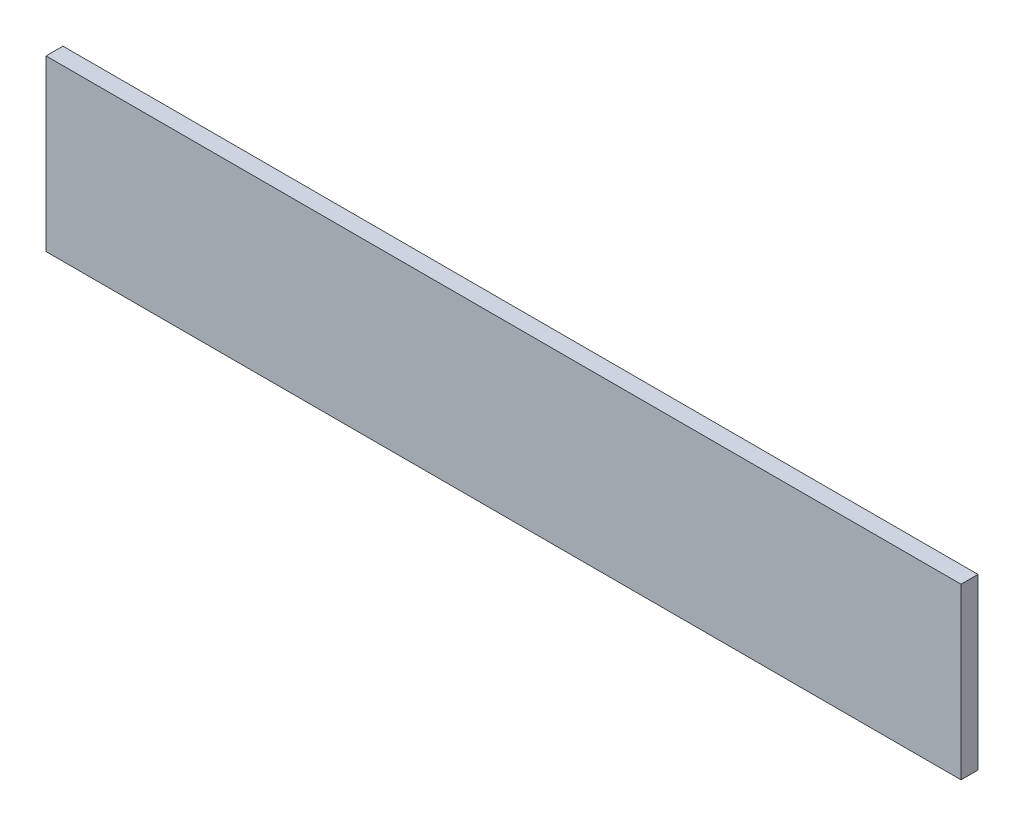
ISO-10303-21;
HEADER;
FILE_DESCRIPTION(('STEP AP214'),'2;1');
FILE_NAME('part.step','',(''),(''),'','','');
FILE_SCHEMA(('AUTOMOTIVE_DESIGN { 1 0 10303 214 1 1 1 1 }'));
ENDSEC;
DATA;
#1=APPLICATION_CONTEXT('core data for automotive mechanical design processes');
#2=APPLICATION_PROTOCOL_DEFINITION('international standard','automotive_design',2000,#1);
#3=PRODUCT_CONTEXT('',#1,'mechanical');
#4=PRODUCT('Part','Part','',(#3));
#5=PRODUCT_RELATED_PRODUCT_CATEGORY('part','',(#4));
#6=PRODUCT_DEFINITION_FORMATION('','',#4);
#7=PRODUCT_DEFINITION_CONTEXT('part definition',#1,'design');
#8=PRODUCT_DEFINITION('design','',#6,#7);
#9=PRODUCT_DEFINITION_SHAPE('','',#8);
#10=(LENGTH_UNIT() NAMED_UNIT(*) SI_UNIT(.MILLI.,.METRE.));
#11=(NAMED_UNIT(*) PLANE_ANGLE_UNIT() SI_UNIT($,.RADIAN.));
#12=(NAMED_UNIT(*) SI_UNIT($,.STERADIAN.) SOLID_ANGLE_UNIT());
#13=UNCERTAINTY_MEASURE_WITH_UNIT(LENGTH_MEASURE(1.E-05),#10,'distance_accuracy_value','');
#14=(GEOMETRIC_REPRESENTATION_CONTEXT(3) GLOBAL_UNCERTAINTY_ASSIGNED_CONTEXT((#13)) GLOBAL_UNIT_ASSIGNED_CONTEXT((#10,
#11,#12)) REPRESENTATION_CONTEXT('',''));
#15=CARTESIAN_POINT('',(0.,0.,0.));
#16=DIRECTION('',(0.,0.,1.));
#17=DIRECTION('',(1.,0.,0.));
#18=AXIS2_PLACEMENT_3D('',#15,#16,#17);
#19=CARTESIAN_POINT('',(135.,25.,5.));
#20=DIRECTION('',(-1.,0.,0.));
#21=DIRECTION('',(0.,-1.,0.));
#22=AXIS2_PLACEMENT_3D('',#19,#20,#21);
#23=PLANE('',#22);
#24=DIRECTION('',(0.,1.,0.));
#25=VECTOR('',#24,1.);
#26=CARTESIAN_POINT('',(135.,25.,0.));
#27=LINE('',#26,#25);
#28=CARTESIAN_POINT('',(135.,-25.,0.));
#29=VERTEX_POINT('',#28);
#30=CARTESIAN_POINT('',(135.,25.,0.));
#31=VERTEX_POINT('',#30);
#32=EDGE_CURVE('E96',#29,#31,#27,.T.);
#33=ORIENTED_EDGE('',*,*,#32,.T.);
#34=DIRECTION('',(0.,0.,-1.));
#35=VECTOR('',#34,1.);
#36=CARTESIAN_POINT('',(135.,25.,5.));
#37=LINE('',#36,#35);
#38=CARTESIAN_POINT('',(135.,25.,5.));
#39=VERTEX_POINT('',#38);
#40=EDGE_CURVE('E11',#39,#31,#37,.T.);
#41=ORIENTED_EDGE('',*,*,#40,.F.);
#42=DIRECTION('',(0.,1.,0.));
#43=VECTOR('',#42,1.);
#44=CARTESIAN_POINT('',(135.,25.,5.));
#45=LINE('',#44,#43);
#46=CARTESIAN_POINT('',(135.,-25.,5.));
#47=VERTEX_POINT('',#46);
#48=EDGE_CURVE('E84',#47,#39,#45,.T.);
#49=ORIENTED_EDGE('',*,*,#48,.F.);
#50=DIRECTION('',(0.,0.,-1.));
#51=VECTOR('',#50,1.);
#52=CARTESIAN_POINT('',(135.,-25.,5.));
#53=LINE('',#52,#51);
#54=EDGE_CURVE('E92',#47,#29,#53,.T.);
#55=ORIENTED_EDGE('',*,*,#54,.T.);
#56=EDGE_LOOP('',(#33,#41,#49,#55));
#57=FACE_BOUND('',#56,.T.);
#58=ADVANCED_FACE('F33',(#57),#23,.F.);
#59=CARTESIAN_POINT('',(-135.,25.,5.));
#60=DIRECTION('',(0.,-1.,0.));
#61=DIRECTION('',(0.,0.,-1.));
#62=AXIS2_PLACEMENT_3D('',#59,#60,#61);
#63=PLANE('',#62);
#64=DIRECTION('',(-1.,0.,0.));
#65=VECTOR('',#64,1.);
#66=CARTESIAN_POINT('',(-135.,25.,0.));
#67=LINE('',#66,#65);
#68=CARTESIAN_POINT('',(-135.,25.,0.));
#69=VERTEX_POINT('',#68);
#70=EDGE_CURVE('E88',#31,#69,#67,.T.);
#71=ORIENTED_EDGE('',*,*,#70,.T.);
#72=DIRECTION('',(0.,0.,-1.));
#73=VECTOR('',#72,1.);
#74=CARTESIAN_POINT('',(-135.,25.,5.));
#75=LINE('',#74,#73);
#76=CARTESIAN_POINT('',(-135.,25.,5.));
#77=VERTEX_POINT('',#76);
#78=EDGE_CURVE('E41',#77,#69,#75,.T.);
#79=ORIENTED_EDGE('',*,*,#78,.F.);
#80=DIRECTION('',(-1.,0.,0.));
#81=VECTOR('',#80,1.);
#82=CARTESIAN_POINT('',(-135.,25.,5.));
#83=LINE('',#82,#81);
#84=EDGE_CURVE('E79',#39,#77,#83,.T.);
#85=ORIENTED_EDGE('',*,*,#84,.F.);
#86=ORIENTED_EDGE('',*,*,#40,.T.);
#87=EDGE_LOOP('',(#71,#79,#85,#86));
#88=FACE_BOUND('',#87,.T.);
#89=ADVANCED_FACE('F87',(#88),#63,.F.);
#90=CARTESIAN_POINT('',(-135.,25.,5.));
#91=DIRECTION('',(1.,0.,0.));
#92=DIRECTION('',(0.,0.,-1.));
#93=AXIS2_PLACEMENT_3D('',#90,#91,#92);
#94=PLANE('',#93);
#95=DIRECTION('',(0.,-1.,0.));
#96=VECTOR('',#95,1.);
#97=CARTESIAN_POINT('',(-135.,25.,0.));
#98=LINE('',#97,#96);
#99=CARTESIAN_POINT('',(-135.,-25.,0.));
#100=VERTEX_POINT('',#99);
#101=EDGE_CURVE('E66',#69,#100,#98,.T.);
#102=ORIENTED_EDGE('',*,*,#101,.T.);
#103=DIRECTION('',(0.,0.,-1.));
#104=VECTOR('',#103,1.);
#105=CARTESIAN_POINT('',(-135.,-25.,5.));
#106=LINE('',#105,#104);
#107=CARTESIAN_POINT('',(-135.,-25.,5.));
#108=VERTEX_POINT('',#107);
#109=EDGE_CURVE('E89',#108,#100,#106,.T.);
#110=ORIENTED_EDGE('',*,*,#109,.F.);
#111=DIRECTION('',(0.,-1.,0.));
#112=VECTOR('',#111,1.);
#113=CARTESIAN_POINT('',(-135.,25.,5.));
#114=LINE('',#113,#112);
#115=EDGE_CURVE('E82',#77,#108,#114,.T.);
#116=ORIENTED_EDGE('',*,*,#115,.F.);
#117=ORIENTED_EDGE('',*,*,#78,.T.);
#118=EDGE_LOOP('',(#102,#110,#116,#117));
#119=FACE_BOUND('',#118,.T.);
#120=ADVANCED_FACE('F90',(#119),#94,.F.);
#121=CARTESIAN_POINT('',(-135.,-25.,5.));
#122=DIRECTION('',(0.,1.,0.));
#123=DIRECTION('',(0.,0.,1.));
#124=AXIS2_PLACEMENT_3D('',#121,#122,#123);
#125=PLANE('',#124);
#126=DIRECTION('',(1.,0.,0.));
#127=VECTOR('',#126,1.);
#128=CARTESIAN_POINT('',(-135.,-25.,0.));
#129=LINE('',#128,#127);
#130=EDGE_CURVE('E72',#100,#29,#129,.T.);
#131=ORIENTED_EDGE('',*,*,#130,.T.);
#132=ORIENTED_EDGE('',*,*,#54,.F.);
#133=DIRECTION('',(1.,0.,0.));
#134=VECTOR('',#133,1.);
#135=CARTESIAN_POINT('',(-135.,-25.,5.));
#136=LINE('',#135,#134);
#137=EDGE_CURVE('E49',#108,#47,#136,.T.);
#138=ORIENTED_EDGE('',*,*,#137,.F.);
#139=ORIENTED_EDGE('',*,*,#109,.T.);
#140=EDGE_LOOP('',(#131,#132,#138,#139));
#141=FACE_BOUND('',#140,.T.);
#142=ADVANCED_FACE('F103',(#141),#125,.F.);
#143=CARTESIAN_POINT('',(0.,0.,5.));
#144=DIRECTION('',(0.,0.,1.));
#145=DIRECTION('',(1.,0.,0.));
#146=AXIS2_PLACEMENT_3D('',#143,#144,#145);
#147=PLANE('',#146);
#148=ORIENTED_EDGE('',*,*,#48,.T.);
#149=ORIENTED_EDGE('',*,*,#84,.T.);
#150=ORIENTED_EDGE('',*,*,#115,.T.);
#151=ORIENTED_EDGE('',*,*,#137,.T.);
#152=EDGE_LOOP('',(#148,#149,#150,#151));
#153=FACE_BOUND('',#152,.T.);
#154=ADVANCED_FACE('F80',(#153),#147,.T.);
#155=CARTESIAN_POINT('',(0.,0.,0.));
#156=DIRECTION('',(0.,0.,1.));
#157=DIRECTION('',(1.,0.,0.));
#158=AXIS2_PLACEMENT_3D('',#155,#156,#157);
#159=PLANE('',#158);
#160=ORIENTED_EDGE('',*,*,#32,.F.);
#161=ORIENTED_EDGE('',*,*,#130,.F.);
#162=ORIENTED_EDGE('',*,*,#101,.F.);
#163=ORIENTED_EDGE('',*,*,#70,.F.);
#164=EDGE_LOOP('',(#160,#161,#162,#163));
#165=FACE_BOUND('',#164,.T.);
#166=ADVANCED_FACE('F106',(#165),#159,.F.);
#167=CLOSED_SHELL('',(#58,#89,#120,#142,#154,#166));
#168=MANIFOLD_SOLID_BREP('B2',#167);
#169=ADVANCED_BREP_SHAPE_REPRESENTATION('',(#18,#168),#14);
#170=SHAPE_DEFINITION_REPRESENTATION(#9,#169);
ENDSEC;
END-ISO-10303-21;
